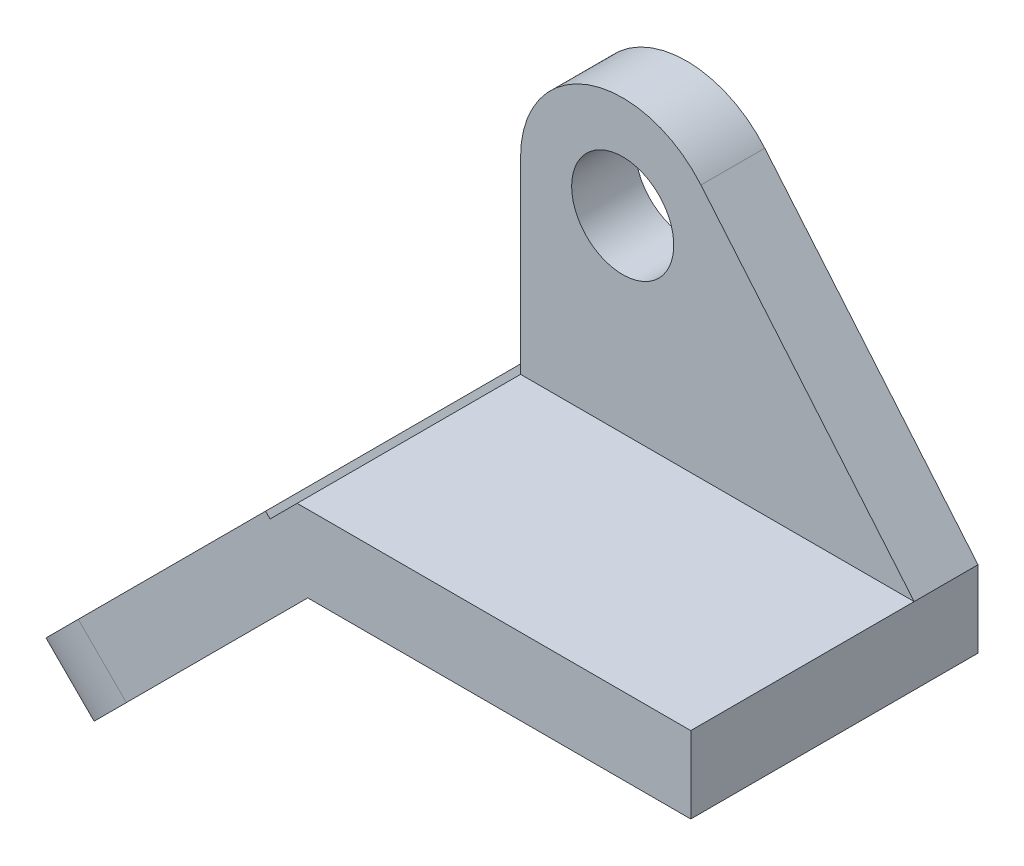
ISO-10303-21;
HEADER;
FILE_DESCRIPTION(('STEP AP214'),'2;1');
FILE_NAME('part.step','',(''),(''),'','','');
FILE_SCHEMA(('AUTOMOTIVE_DESIGN { 1 0 10303 214 1 1 1 1 }'));
ENDSEC;
DATA;
#1=APPLICATION_CONTEXT('core data for automotive mechanical design processes');
#2=APPLICATION_PROTOCOL_DEFINITION('international standard','automotive_design',2000,#1);
#3=PRODUCT_CONTEXT('',#1,'mechanical');
#4=PRODUCT('Part','Part','',(#3));
#5=PRODUCT_RELATED_PRODUCT_CATEGORY('part','',(#4));
#6=PRODUCT_DEFINITION_FORMATION('','',#4);
#7=PRODUCT_DEFINITION_CONTEXT('part definition',#1,'design');
#8=PRODUCT_DEFINITION('design','',#6,#7);
#9=PRODUCT_DEFINITION_SHAPE('','',#8);
#10=(LENGTH_UNIT() NAMED_UNIT(*) SI_UNIT(.MILLI.,.METRE.));
#11=(NAMED_UNIT(*) PLANE_ANGLE_UNIT() SI_UNIT($,.RADIAN.));
#12=(NAMED_UNIT(*) SI_UNIT($,.STERADIAN.) SOLID_ANGLE_UNIT());
#13=UNCERTAINTY_MEASURE_WITH_UNIT(LENGTH_MEASURE(1.E-05),#10,'distance_accuracy_value','');
#14=(GEOMETRIC_REPRESENTATION_CONTEXT(3) GLOBAL_UNCERTAINTY_ASSIGNED_CONTEXT((#13)) GLOBAL_UNIT_ASSIGNED_CONTEXT((#10,
#11,#12)) REPRESENTATION_CONTEXT('',''));
#15=CARTESIAN_POINT('',(0.,0.,0.));
#16=DIRECTION('',(0.,0.,1.));
#17=DIRECTION('',(1.,0.,0.));
#18=AXIS2_PLACEMENT_3D('',#15,#16,#17);
#19=CARTESIAN_POINT('',(-35.9507429885581,-20.8754143047335,22.5));
#20=DIRECTION('',(0.707106781186549,-0.707106781186546,0.));
#21=DIRECTION('',(0.707106781186546,0.707106781186549,0.));
#22=AXIS2_PLACEMENT_3D('',#19,#20,#21);
#23=CYLINDRICAL_SURFACE('',#22,22.5);
#24=DIRECTION('',(0.707106781186549,-0.707106781186546,0.));
#25=VECTOR('',#24,1.);
#26=CARTESIAN_POINT('',(-28.4130786466457,-28.4130786466459,45.));
#27=LINE('',#26,#25);
#28=CARTESIAN_POINT('',(-35.9507429885581,-20.8754143047335,45.));
#29=VERTEX_POINT('',#28);
#30=CARTESIAN_POINT('',(-28.4130786466458,-28.4130786466458,45.));
#31=VERTEX_POINT('',#30);
#32=EDGE_CURVE('E174',#29,#31,#27,.T.);
#33=ORIENTED_EDGE('',*,*,#32,.F.);
#34=CARTESIAN_POINT('',(-35.9507429885581,-20.8754143047335,22.5));
#35=DIRECTION('',(0.707106781186549,-0.707106781186546,0.));
#36=DIRECTION('',(0.707106781186546,0.707106781186549,0.));
#37=AXIS2_PLACEMENT_3D('',#34,#35,#36);
#38=CIRCLE('',#37,22.5);
#39=CARTESIAN_POINT('',(-35.9507429885581,-20.8754143047335,0.));
#40=VERTEX_POINT('',#39);
#41=EDGE_CURVE('E169',#40,#29,#38,.F.);
#42=ORIENTED_EDGE('',*,*,#41,.F.);
#43=DIRECTION('',(-0.707106781186549,0.707106781186546,0.));
#44=VECTOR('',#43,1.);
#45=CARTESIAN_POINT('',(-35.9507429885581,-20.8754143047335,0.));
#46=LINE('',#45,#44);
#47=CARTESIAN_POINT('',(-28.4130786466458,-28.4130786466458,0.));
#48=VERTEX_POINT('',#47);
#49=EDGE_CURVE('E171',#48,#40,#46,.T.);
#50=ORIENTED_EDGE('',*,*,#49,.F.);
#51=CARTESIAN_POINT('',(-28.4130786466457,-28.4130786466458,22.5));
#52=DIRECTION('',(-0.707106781186548,0.707106781186546,0.));
#53=DIRECTION('',(-0.707106781186547,-0.707106781186549,0.));
#54=AXIS2_PLACEMENT_3D('',#51,#52,#53);
#55=CIRCLE('',#54,22.5);
#56=EDGE_CURVE('E152',#31,#48,#55,.F.);
#57=ORIENTED_EDGE('',*,*,#56,.F.);
#58=EDGE_LOOP('',(#33,#42,#50,#57));
#59=FACE_BOUND('',#58,.T.);
#60=ADVANCED_FACE('F43',(#59),#23,.T.);
#61=CARTESIAN_POINT('',(0.,0.,45.));
#62=DIRECTION('',(-0.707106781186548,0.707106781186546,0.));
#63=DIRECTION('',(-0.707106781186547,-0.707106781186549,0.));
#64=AXIS2_PLACEMENT_3D('',#61,#62,#63);
#65=PLANE('',#64);
#66=DIRECTION('',(-0.707106781186547,-0.707106781186549,0.));
#67=VECTOR('',#66,1.);
#68=CARTESIAN_POINT('',(0.,0.,30.5));
#69=LINE('',#68,#67);
#70=CARTESIAN_POINT('',(-14.2709430229148,-14.2709430229149,30.5));
#71=VERTEX_POINT('',#70);
#72=CARTESIAN_POINT('',(-28.4130786466458,-28.4130786466458,30.5));
#73=VERTEX_POINT('',#72);
#74=EDGE_CURVE('E263',#71,#73,#69,.T.);
#75=ORIENTED_EDGE('',*,*,#74,.F.);
#76=CARTESIAN_POINT('',(-14.2709430229148,-14.2709430229149,22.5));
#77=DIRECTION('',(-0.707106781186548,0.707106781186546,0.));
#78=DIRECTION('',(-0.707106781186547,-0.707106781186549,0.));
#79=AXIS2_PLACEMENT_3D('',#76,#77,#78);
#80=CIRCLE('',#79,8.);
#81=CARTESIAN_POINT('',(-14.2709430229148,-14.2709430229149,14.5));
#82=VERTEX_POINT('',#81);
#83=EDGE_CURVE('E258',#71,#82,#80,.T.);
#84=ORIENTED_EDGE('',*,*,#83,.T.);
#85=DIRECTION('',(-0.707106781186547,-0.707106781186549,0.));
#86=VECTOR('',#85,1.);
#87=CARTESIAN_POINT('',(0.,0.,14.5));
#88=LINE('',#87,#86);
#89=CARTESIAN_POINT('',(-28.4130786466458,-28.4130786466458,14.5));
#90=VERTEX_POINT('',#89);
#91=EDGE_CURVE('E266',#82,#90,#88,.T.);
#92=ORIENTED_EDGE('',*,*,#91,.T.);
#93=CARTESIAN_POINT('',(-28.4130786466458,-28.4130786466458,22.5));
#94=DIRECTION('',(-0.707106781186548,0.707106781186546,0.));
#95=DIRECTION('',(-0.707106781186547,-0.707106781186549,0.));
#96=AXIS2_PLACEMENT_3D('',#93,#94,#95);
#97=CIRCLE('',#96,8.00000000000001);
#98=EDGE_CURVE('E159',#90,#73,#97,.T.);
#99=ORIENTED_EDGE('',*,*,#98,.T.);
#100=EDGE_LOOP('',(#75,#84,#92,#99));
#101=FACE_BOUND('',#100,.T.);
#102=DIRECTION('',(0.707106781186547,0.707106781186549,0.));
#103=VECTOR('',#102,1.);
#104=CARTESIAN_POINT('',(0.,0.,45.));
#105=LINE('',#104,#103);
#106=CARTESIAN_POINT('',(0.,0.,45.));
#107=VERTEX_POINT('',#106);
#108=EDGE_CURVE('E199',#31,#107,#105,.T.);
#109=ORIENTED_EDGE('',*,*,#108,.F.);
#110=ORIENTED_EDGE('',*,*,#56,.T.);
#111=DIRECTION('',(0.707106781186547,0.707106781186549,0.));
#112=VECTOR('',#111,1.);
#113=CARTESIAN_POINT('',(0.,0.,0.));
#114=LINE('',#113,#112);
#115=CARTESIAN_POINT('',(0.,0.,0.));
#116=VERTEX_POINT('',#115);
#117=EDGE_CURVE('E209',#48,#116,#114,.T.);
#118=ORIENTED_EDGE('',*,*,#117,.T.);
#119=DIRECTION('',(0.,0.,-1.));
#120=VECTOR('',#119,1.);
#121=CARTESIAN_POINT('',(0.,0.,45.));
#122=LINE('',#121,#120);
#123=EDGE_CURVE('E177',#107,#116,#122,.T.);
#124=ORIENTED_EDGE('',*,*,#123,.F.);
#125=EDGE_LOOP('',(#109,#110,#118,#124));
#126=FACE_BOUND('',#125,.T.);
#127=ADVANCED_FACE('F279',(#101,#126),#65,.F.);
#128=CARTESIAN_POINT('',(0.,0.,45.));
#129=DIRECTION('',(0.,1.,0.));
#130=DIRECTION('',(0.,0.,1.));
#131=AXIS2_PLACEMENT_3D('',#128,#129,#130);
#132=PLANE('',#131);
#133=DIRECTION('',(1.,0.,0.));
#134=VECTOR('',#133,1.);
#135=CARTESIAN_POINT('',(0.,0.,0.));
#136=LINE('',#135,#134);
#137=CARTESIAN_POINT('',(60.,0.,0.));
#138=VERTEX_POINT('',#137);
#139=EDGE_CURVE('E207',#116,#138,#136,.T.);
#140=ORIENTED_EDGE('',*,*,#139,.T.);
#141=DIRECTION('',(0.,0.,-1.));
#142=VECTOR('',#141,1.);
#143=CARTESIAN_POINT('',(60.,0.,45.));
#144=LINE('',#143,#142);
#145=CARTESIAN_POINT('',(60.,0.,45.));
#146=VERTEX_POINT('',#145);
#147=EDGE_CURVE('E180',#146,#138,#144,.T.);
#148=ORIENTED_EDGE('',*,*,#147,.F.);
#149=DIRECTION('',(1.,0.,0.));
#150=VECTOR('',#149,1.);
#151=CARTESIAN_POINT('',(0.,0.,45.));
#152=LINE('',#151,#150);
#153=EDGE_CURVE('E222',#107,#146,#152,.T.);
#154=ORIENTED_EDGE('',*,*,#153,.F.);
#155=ORIENTED_EDGE('',*,*,#123,.T.);
#156=EDGE_LOOP('',(#140,#148,#154,#155));
#157=FACE_BOUND('',#156,.T.);
#158=ADVANCED_FACE('F282',(#157),#132,.F.);
#159=CARTESIAN_POINT('',(60.,0.,45.));
#160=DIRECTION('',(-1.,0.,0.));
#161=DIRECTION('',(0.,-1.,0.));
#162=AXIS2_PLACEMENT_3D('',#159,#160,#161);
#163=PLANE('',#162);
#164=DIRECTION('',(0.,1.,0.));
#165=VECTOR('',#164,1.);
#166=CARTESIAN_POINT('',(60.,0.,0.));
#167=LINE('',#166,#165);
#168=CARTESIAN_POINT('',(60.,12.,0.));
#169=VERTEX_POINT('',#168);
#170=EDGE_CURVE('E204',#138,#169,#167,.T.);
#171=ORIENTED_EDGE('',*,*,#170,.T.);
#172=DIRECTION('',(0.,0.,-1.));
#173=VECTOR('',#172,1.);
#174=CARTESIAN_POINT('',(60.,12.,10.));
#175=LINE('',#174,#173);
#176=CARTESIAN_POINT('',(60.,12.,10.));
#177=VERTEX_POINT('',#176);
#178=EDGE_CURVE('E211',#177,#169,#175,.T.);
#179=ORIENTED_EDGE('',*,*,#178,.F.);
#180=DIRECTION('',(0.,0.,-1.));
#181=VECTOR('',#180,1.);
#182=CARTESIAN_POINT('',(60.,12.,45.));
#183=LINE('',#182,#181);
#184=CARTESIAN_POINT('',(60.,12.,45.));
#185=VERTEX_POINT('',#184);
#186=EDGE_CURVE('E183',#185,#177,#183,.T.);
#187=ORIENTED_EDGE('',*,*,#186,.F.);
#188=DIRECTION('',(0.,1.,0.));
#189=VECTOR('',#188,1.);
#190=CARTESIAN_POINT('',(60.,0.,45.));
#191=LINE('',#190,#189);
#192=EDGE_CURVE('E220',#146,#185,#191,.T.);
#193=ORIENTED_EDGE('',*,*,#192,.F.);
#194=ORIENTED_EDGE('',*,*,#147,.T.);
#195=EDGE_LOOP('',(#171,#179,#187,#193,#194));
#196=FACE_BOUND('',#195,.T.);
#197=ADVANCED_FACE('F297',(#196),#163,.F.);
#198=CARTESIAN_POINT('',(60.,12.,45.));
#199=DIRECTION('',(0.,-1.,0.));
#200=DIRECTION('',(1.,0.,0.));
#201=AXIS2_PLACEMENT_3D('',#198,#199,#200);
#202=PLANE('',#201);
#203=ORIENTED_EDGE('',*,*,#186,.T.);
#204=DIRECTION('',(-1.,0.,0.));
#205=VECTOR('',#204,1.);
#206=CARTESIAN_POINT('',(60.,12.,10.));
#207=LINE('',#206,#205);
#208=CARTESIAN_POINT('',(-1.66111512145166,12.,10.));
#209=VERTEX_POINT('',#208);
#210=EDGE_CURVE('E237',#177,#209,#207,.T.);
#211=ORIENTED_EDGE('',*,*,#210,.T.);
#212=DIRECTION('',(0.,0.,-1.));
#213=VECTOR('',#212,1.);
#214=CARTESIAN_POINT('',(-1.66111512145166,12.,45.));
#215=LINE('',#214,#213);
#216=CARTESIAN_POINT('',(-1.66111512145166,12.,45.));
#217=VERTEX_POINT('',#216);
#218=EDGE_CURVE('E186',#217,#209,#215,.T.);
#219=ORIENTED_EDGE('',*,*,#218,.F.);
#220=DIRECTION('',(-1.,0.,0.));
#221=VECTOR('',#220,1.);
#222=CARTESIAN_POINT('',(60.,12.,45.));
#223=LINE('',#222,#221);
#224=EDGE_CURVE('E218',#185,#217,#223,.T.);
#225=ORIENTED_EDGE('',*,*,#224,.F.);
#226=EDGE_LOOP('',(#203,#211,#219,#225));
#227=FACE_BOUND('',#226,.T.);
#228=ADVANCED_FACE('F304',(#227),#202,.F.);
#229=CARTESIAN_POINT('',(-1.66111512145166,12.,45.));
#230=DIRECTION('',(0.707106781186548,-0.707106781186546,0.));
#231=DIRECTION('',(0.707106781186546,0.707106781186549,0.));
#232=AXIS2_PLACEMENT_3D('',#229,#230,#231);
#233=PLANE('',#232);
#234=DIRECTION('',(-0.707106781186546,-0.707106781186548,0.));
#235=VECTOR('',#234,1.);
#236=CARTESIAN_POINT('',(-1.66111512145166,12.,0.));
#237=LINE('',#236,#235);
#238=CARTESIAN_POINT('',(-1.66111512145166,12.,0.));
#239=VERTEX_POINT('',#238);
#240=CARTESIAN_POINT('',(-5.90375580857094,7.7573593128807,0.));
#241=VERTEX_POINT('',#240);
#242=EDGE_CURVE('E202',#239,#241,#237,.T.);
#243=ORIENTED_EDGE('',*,*,#242,.T.);
#244=DIRECTION('',(0.,0.,-1.));
#245=VECTOR('',#244,1.);
#246=CARTESIAN_POINT('',(-5.90375580857094,7.7573593128807,45.));
#247=LINE('',#246,#245);
#248=CARTESIAN_POINT('',(-5.90375580857094,7.7573593128807,45.));
#249=VERTEX_POINT('',#248);
#250=EDGE_CURVE('E189',#249,#241,#247,.T.);
#251=ORIENTED_EDGE('',*,*,#250,.F.);
#252=DIRECTION('',(-0.707106781186546,-0.707106781186548,0.));
#253=VECTOR('',#252,1.);
#254=CARTESIAN_POINT('',(-1.66111512145166,12.,45.));
#255=LINE('',#254,#253);
#256=EDGE_CURVE('E216',#217,#249,#255,.T.);
#257=ORIENTED_EDGE('',*,*,#256,.F.);
#258=ORIENTED_EDGE('',*,*,#218,.T.);
#259=DIRECTION('',(0.,0.,-1.));
#260=VECTOR('',#259,1.);
#261=CARTESIAN_POINT('',(-1.66111512145166,12.,10.));
#262=LINE('',#261,#260);
#263=EDGE_CURVE('E225',#209,#239,#262,.T.);
#264=ORIENTED_EDGE('',*,*,#263,.T.);
#265=EDGE_LOOP('',(#243,#251,#257,#258,#264));
#266=FACE_BOUND('',#265,.T.);
#267=ADVANCED_FACE('F306',(#266),#233,.F.);
#268=CARTESIAN_POINT('',(-5.90375580857094,7.7573593128807,45.));
#269=DIRECTION('',(-0.707106781186546,-0.707106781186549,0.));
#270=DIRECTION('',(0.707106781186549,-0.707106781186546,0.));
#271=AXIS2_PLACEMENT_3D('',#268,#269,#270);
#272=PLANE('',#271);
#273=DIRECTION('',(-0.707106781186549,0.707106781186546,0.));
#274=VECTOR('',#273,1.);
#275=CARTESIAN_POINT('',(-5.90375580857094,7.7573593128807,0.));
#276=LINE('',#275,#274);
#277=CARTESIAN_POINT('',(-6.61086258975749,8.46446609406725,0.));
#278=VERTEX_POINT('',#277);
#279=EDGE_CURVE('E200',#241,#278,#276,.T.);
#280=ORIENTED_EDGE('',*,*,#279,.T.);
#281=DIRECTION('',(0.,0.,-1.));
#282=VECTOR('',#281,1.);
#283=CARTESIAN_POINT('',(-6.61086258975749,8.46446609406725,45.));
#284=LINE('',#283,#282);
#285=CARTESIAN_POINT('',(-6.61086258975749,8.46446609406725,45.));
#286=VERTEX_POINT('',#285);
#287=EDGE_CURVE('E192',#286,#278,#284,.T.);
#288=ORIENTED_EDGE('',*,*,#287,.F.);
#289=DIRECTION('',(-0.707106781186549,0.707106781186546,0.));
#290=VECTOR('',#289,1.);
#291=CARTESIAN_POINT('',(-5.90375580857094,7.7573593128807,45.));
#292=LINE('',#291,#290);
#293=EDGE_CURVE('E214',#249,#286,#292,.T.);
#294=ORIENTED_EDGE('',*,*,#293,.F.);
#295=ORIENTED_EDGE('',*,*,#250,.T.);
#296=EDGE_LOOP('',(#280,#288,#294,#295));
#297=FACE_BOUND('',#296,.T.);
#298=ADVANCED_FACE('F312',(#297),#272,.F.);
#299=CARTESIAN_POINT('',(-6.61086258975749,8.46446609406725,45.));
#300=DIRECTION('',(0.707106781186549,-0.707106781186546,0.));
#301=DIRECTION('',(0.707106781186546,0.707106781186549,0.));
#302=AXIS2_PLACEMENT_3D('',#299,#300,#301);
#303=PLANE('',#302);
#304=DIRECTION('',(0.707106781186546,0.707106781186549,0.));
#305=VECTOR('',#304,1.);
#306=CARTESIAN_POINT('',(-6.61086258975748,8.46446609406725,14.5));
#307=LINE('',#306,#305);
#308=CARTESIAN_POINT('',(-35.9507429885581,-20.8754143047335,14.5));
#309=VERTEX_POINT('',#308);
#310=CARTESIAN_POINT('',(-21.8086073648272,-6.73327868100252,14.5));
#311=VERTEX_POINT('',#310);
#312=EDGE_CURVE('E147',#309,#311,#307,.T.);
#313=ORIENTED_EDGE('',*,*,#312,.T.);
#314=CARTESIAN_POINT('',(-21.8086073648272,-6.73327868100251,22.5));
#315=DIRECTION('',(0.707106781186549,-0.707106781186546,0.));
#316=DIRECTION('',(0.707106781186546,0.707106781186549,0.));
#317=AXIS2_PLACEMENT_3D('',#314,#315,#316);
#318=CIRCLE('',#317,8.);
#319=CARTESIAN_POINT('',(-21.8086073648272,-6.73327868100252,30.5));
#320=VERTEX_POINT('',#319);
#321=EDGE_CURVE('E11',#311,#320,#318,.T.);
#322=ORIENTED_EDGE('',*,*,#321,.T.);
#323=DIRECTION('',(0.707106781186546,0.707106781186549,0.));
#324=VECTOR('',#323,1.);
#325=CARTESIAN_POINT('',(-6.61086258975749,8.46446609406724,30.5));
#326=LINE('',#325,#324);
#327=CARTESIAN_POINT('',(-35.9507429885581,-20.8754143047335,30.5));
#328=VERTEX_POINT('',#327);
#329=EDGE_CURVE('E51',#328,#320,#326,.T.);
#330=ORIENTED_EDGE('',*,*,#329,.F.);
#331=CARTESIAN_POINT('',(-35.9507429885581,-20.8754143047335,22.5));
#332=DIRECTION('',(0.707106781186549,-0.707106781186546,0.));
#333=DIRECTION('',(0.707106781186546,0.707106781186549,0.));
#334=AXIS2_PLACEMENT_3D('',#331,#332,#333);
#335=CIRCLE('',#334,8.00000000000001);
#336=EDGE_CURVE('E151',#328,#309,#335,.T.);
#337=ORIENTED_EDGE('',*,*,#336,.T.);
#338=EDGE_LOOP('',(#313,#322,#330,#337));
#339=FACE_BOUND('',#338,.T.);
#340=DIRECTION('',(-0.707106781186546,-0.707106781186549,0.));
#341=VECTOR('',#340,1.);
#342=CARTESIAN_POINT('',(-6.61086258975749,8.46446609406725,0.));
#343=LINE('',#342,#341);
#344=EDGE_CURVE('E196',#278,#40,#343,.T.);
#345=ORIENTED_EDGE('',*,*,#344,.T.);
#346=ORIENTED_EDGE('',*,*,#41,.T.);
#347=DIRECTION('',(-0.707106781186546,-0.707106781186549,0.));
#348=VECTOR('',#347,1.);
#349=CARTESIAN_POINT('',(-6.61086258975749,8.46446609406725,45.));
#350=LINE('',#349,#348);
#351=EDGE_CURVE('E195',#286,#29,#350,.T.);
#352=ORIENTED_EDGE('',*,*,#351,.F.);
#353=ORIENTED_EDGE('',*,*,#287,.T.);
#354=EDGE_LOOP('',(#345,#346,#352,#353));
#355=FACE_BOUND('',#354,.T.);
#356=ADVANCED_FACE('F164',(#339,#355),#303,.F.);
#357=CARTESIAN_POINT('',(0.,0.,45.));
#358=DIRECTION('',(0.,0.,-1.));
#359=DIRECTION('',(-1.,0.,0.));
#360=AXIS2_PLACEMENT_3D('',#357,#358,#359);
#361=PLANE('',#360);
#362=ORIENTED_EDGE('',*,*,#351,.T.);
#363=ORIENTED_EDGE('',*,*,#32,.T.);
#364=ORIENTED_EDGE('',*,*,#108,.T.);
#365=ORIENTED_EDGE('',*,*,#153,.T.);
#366=ORIENTED_EDGE('',*,*,#192,.T.);
#367=ORIENTED_EDGE('',*,*,#224,.T.);
#368=ORIENTED_EDGE('',*,*,#256,.T.);
#369=ORIENTED_EDGE('',*,*,#293,.T.);
#370=EDGE_LOOP('',(#362,#363,#364,#365,#366,#367,#368,#369));
#371=FACE_BOUND('',#370,.T.);
#372=ADVANCED_FACE('F288',(#371),#361,.F.);
#373=CARTESIAN_POINT('',(0.,0.,0.));
#374=DIRECTION('',(0.,0.,-1.));
#375=DIRECTION('',(-1.,0.,0.));
#376=AXIS2_PLACEMENT_3D('',#373,#374,#375);
#377=PLANE('',#376);
#378=ORIENTED_EDGE('',*,*,#117,.F.);
#379=ORIENTED_EDGE('',*,*,#49,.T.);
#380=ORIENTED_EDGE('',*,*,#344,.F.);
#381=ORIENTED_EDGE('',*,*,#279,.F.);
#382=ORIENTED_EDGE('',*,*,#242,.F.);
#383=DIRECTION('',(0.,1.,0.));
#384=VECTOR('',#383,1.);
#385=CARTESIAN_POINT('',(-1.66111512145166,12.,0.));
#386=LINE('',#385,#384);
#387=CARTESIAN_POINT('',(-1.66111512145166,41.5252167580814,0.));
#388=VERTEX_POINT('',#387);
#389=EDGE_CURVE('E241',#239,#388,#386,.T.);
#390=ORIENTED_EDGE('',*,*,#389,.T.);
#391=CARTESIAN_POINT('',(14.3388848785483,41.5252167580814,0.));
#392=DIRECTION('',(0.,0.,-1.));
#393=DIRECTION('',(-1.,0.,0.));
#394=AXIS2_PLACEMENT_3D('',#391,#392,#393);
#395=CIRCLE('',#394,16.);
#396=CARTESIAN_POINT('',(26.595595968452,51.809818513066,0.));
#397=VERTEX_POINT('',#396);
#398=EDGE_CURVE('E238',#388,#397,#395,.T.);
#399=ORIENTED_EDGE('',*,*,#398,.T.);
#400=DIRECTION('',(0.642787609686538,-0.766044443118979,0.));
#401=VECTOR('',#400,1.);
#402=CARTESIAN_POINT('',(60.,12.,0.));
#403=LINE('',#402,#401);
#404=EDGE_CURVE('E234',#397,#169,#403,.T.);
#405=ORIENTED_EDGE('',*,*,#404,.T.);
#406=ORIENTED_EDGE('',*,*,#170,.F.);
#407=ORIENTED_EDGE('',*,*,#139,.F.);
#408=EDGE_LOOP('',(#378,#379,#380,#381,#382,#390,#399,#405,#406,#407));
#409=FACE_BOUND('',#408,.T.);
#410=CARTESIAN_POINT('',(14.3388848785483,41.5252167580814,0.));
#411=DIRECTION('',(0.,0.,-1.));
#412=DIRECTION('',(-1.,0.,0.));
#413=AXIS2_PLACEMENT_3D('',#410,#411,#412);
#414=CIRCLE('',#413,8.);
#415=CARTESIAN_POINT('',(6.33888487854834,41.5252167580814,0.));
#416=VERTEX_POINT('',#415);
#417=EDGE_CURVE('E255',#416,#416,#414,.T.);
#418=ORIENTED_EDGE('',*,*,#417,.F.);
#419=EDGE_LOOP('',(#418));
#420=FACE_BOUND('',#419,.T.);
#421=ADVANCED_FACE('F318',(#409,#420),#377,.T.);
#422=CARTESIAN_POINT('',(60.,12.,10.));
#423=DIRECTION('',(0.766044443118979,0.642787609686538,0.));
#424=DIRECTION('',(-0.642787609686538,0.766044443118979,0.));
#425=AXIS2_PLACEMENT_3D('',#422,#423,#424);
#426=PLANE('',#425);
#427=ORIENTED_EDGE('',*,*,#404,.F.);
#428=DIRECTION('',(0.,0.,-1.));
#429=VECTOR('',#428,1.);
#430=CARTESIAN_POINT('',(26.595595968452,51.809818513066,10.));
#431=LINE('',#430,#429);
#432=CARTESIAN_POINT('',(26.595595968452,51.809818513066,10.));
#433=VERTEX_POINT('',#432);
#434=EDGE_CURVE('E231',#433,#397,#431,.T.);
#435=ORIENTED_EDGE('',*,*,#434,.F.);
#436=DIRECTION('',(0.642787609686538,-0.766044443118979,0.));
#437=VECTOR('',#436,1.);
#438=CARTESIAN_POINT('',(60.,12.,10.));
#439=LINE('',#438,#437);
#440=EDGE_CURVE('E229',#433,#177,#439,.T.);
#441=ORIENTED_EDGE('',*,*,#440,.T.);
#442=ORIENTED_EDGE('',*,*,#178,.T.);
#443=EDGE_LOOP('',(#427,#435,#441,#442));
#444=FACE_BOUND('',#443,.T.);
#445=ADVANCED_FACE('F322',(#444),#426,.T.);
#446=CARTESIAN_POINT('',(14.3388848785483,41.5252167580814,10.));
#447=DIRECTION('',(0.,0.,-1.));
#448=DIRECTION('',(-1.,0.,0.));
#449=AXIS2_PLACEMENT_3D('',#446,#447,#448);
#450=CYLINDRICAL_SURFACE('',#449,16.);
#451=ORIENTED_EDGE('',*,*,#398,.F.);
#452=DIRECTION('',(0.,0.,-1.));
#453=VECTOR('',#452,1.);
#454=CARTESIAN_POINT('',(-1.66111512145166,41.5252167580814,10.));
#455=LINE('',#454,#453);
#456=CARTESIAN_POINT('',(-1.66111512145166,41.5252167580814,10.));
#457=VERTEX_POINT('',#456);
#458=EDGE_CURVE('E228',#457,#388,#455,.T.);
#459=ORIENTED_EDGE('',*,*,#458,.F.);
#460=CARTESIAN_POINT('',(14.3388848785483,41.5252167580814,10.));
#461=DIRECTION('',(0.,0.,-1.));
#462=DIRECTION('',(-1.,0.,0.));
#463=AXIS2_PLACEMENT_3D('',#460,#461,#462);
#464=CIRCLE('',#463,16.);
#465=EDGE_CURVE('E247',#457,#433,#464,.T.);
#466=ORIENTED_EDGE('',*,*,#465,.T.);
#467=ORIENTED_EDGE('',*,*,#434,.T.);
#468=EDGE_LOOP('',(#451,#459,#466,#467));
#469=FACE_BOUND('',#468,.T.);
#470=ADVANCED_FACE('F332',(#469),#450,.T.);
#471=CARTESIAN_POINT('',(-1.66111512145166,12.,10.));
#472=DIRECTION('',(-1.,0.,0.));
#473=DIRECTION('',(0.,-1.,0.));
#474=AXIS2_PLACEMENT_3D('',#471,#472,#473);
#475=PLANE('',#474);
#476=ORIENTED_EDGE('',*,*,#389,.F.);
#477=ORIENTED_EDGE('',*,*,#263,.F.);
#478=DIRECTION('',(0.,1.,0.));
#479=VECTOR('',#478,1.);
#480=CARTESIAN_POINT('',(-1.66111512145166,12.,10.));
#481=LINE('',#480,#479);
#482=EDGE_CURVE('E250',#209,#457,#481,.T.);
#483=ORIENTED_EDGE('',*,*,#482,.T.);
#484=ORIENTED_EDGE('',*,*,#458,.T.);
#485=EDGE_LOOP('',(#476,#477,#483,#484));
#486=FACE_BOUND('',#485,.T.);
#487=ADVANCED_FACE('F329',(#486),#475,.T.);
#488=CARTESIAN_POINT('',(14.3388848785483,41.5252167580814,10.));
#489=DIRECTION('',(0.,0.,-1.));
#490=DIRECTION('',(-1.,0.,0.));
#491=AXIS2_PLACEMENT_3D('',#488,#489,#490);
#492=PLANE('',#491);
#493=CARTESIAN_POINT('',(14.3388848785483,41.5252167580814,10.));
#494=DIRECTION('',(0.,0.,-1.));
#495=DIRECTION('',(-1.,0.,0.));
#496=AXIS2_PLACEMENT_3D('',#493,#494,#495);
#497=CIRCLE('',#496,8.);
#498=CARTESIAN_POINT('',(6.33888487854834,41.5252167580814,10.));
#499=VERTEX_POINT('',#498);
#500=EDGE_CURVE('E244',#499,#499,#497,.T.);
#501=ORIENTED_EDGE('',*,*,#500,.T.);
#502=EDGE_LOOP('',(#501));
#503=FACE_BOUND('',#502,.T.);
#504=ORIENTED_EDGE('',*,*,#210,.F.);
#505=ORIENTED_EDGE('',*,*,#440,.F.);
#506=ORIENTED_EDGE('',*,*,#465,.F.);
#507=ORIENTED_EDGE('',*,*,#482,.F.);
#508=EDGE_LOOP('',(#504,#505,#506,#507));
#509=FACE_BOUND('',#508,.T.);
#510=ADVANCED_FACE('F326',(#503,#509),#492,.F.);
#511=CARTESIAN_POINT('',(14.3388848785483,41.5252167580814,10.));
#512=DIRECTION('',(0.,0.,-1.));
#513=DIRECTION('',(-1.,0.,0.));
#514=AXIS2_PLACEMENT_3D('',#511,#512,#513);
#515=CYLINDRICAL_SURFACE('',#514,8.);
#516=ORIENTED_EDGE('',*,*,#500,.F.);
#517=EDGE_LOOP('',(#516));
#518=FACE_BOUND('',#517,.T.);
#519=ORIENTED_EDGE('',*,*,#417,.T.);
#520=EDGE_LOOP('',(#519));
#521=FACE_BOUND('',#520,.T.);
#522=ADVANCED_FACE('F350',(#518,#521),#515,.F.);
#523=CARTESIAN_POINT('',(37.8905475887569,-66.4324336345864,22.5));
#524=DIRECTION('',(-0.707106781186549,0.707106781186546,0.));
#525=DIRECTION('',(-0.707106781186546,-0.707106781186549,0.));
#526=AXIS2_PLACEMENT_3D('',#523,#524,#525);
#527=CYLINDRICAL_SURFACE('',#526,8.);
#528=DIRECTION('',(-0.707106781186549,0.707106781186546,0.));
#529=VECTOR('',#528,1.);
#530=CARTESIAN_POINT('',(37.8905475887569,-66.4324336345864,30.5));
#531=LINE('',#530,#529);
#532=EDGE_CURVE('E268',#71,#320,#531,.T.);
#533=ORIENTED_EDGE('',*,*,#532,.T.);
#534=ORIENTED_EDGE('',*,*,#321,.F.);
#535=DIRECTION('',(-0.707106781186549,0.707106781186546,0.));
#536=VECTOR('',#535,1.);
#537=CARTESIAN_POINT('',(37.8905475887569,-66.4324336345864,14.5));
#538=LINE('',#537,#536);
#539=EDGE_CURVE('E63',#82,#311,#538,.T.);
#540=ORIENTED_EDGE('',*,*,#539,.F.);
#541=ORIENTED_EDGE('',*,*,#83,.F.);
#542=EDGE_LOOP('',(#533,#534,#540,#541));
#543=FACE_BOUND('',#542,.T.);
#544=ADVANCED_FACE('F274',(#543),#527,.F.);
#545=CARTESIAN_POINT('',(37.8905475887569,-66.4324336345864,30.5));
#546=DIRECTION('',(0.,0.,-1.));
#547=DIRECTION('',(0.,1.,0.));
#548=AXIS2_PLACEMENT_3D('',#545,#546,#547);
#549=PLANE('',#548);
#550=ORIENTED_EDGE('',*,*,#74,.T.);
#551=DIRECTION('',(-0.707106781186549,0.707106781186546,0.));
#552=VECTOR('',#551,1.);
#553=CARTESIAN_POINT('',(23.7484119650259,-80.5745692583174,30.5));
#554=LINE('',#553,#552);
#555=EDGE_CURVE('E161',#73,#328,#554,.T.);
#556=ORIENTED_EDGE('',*,*,#555,.T.);
#557=ORIENTED_EDGE('',*,*,#329,.T.);
#558=ORIENTED_EDGE('',*,*,#532,.F.);
#559=EDGE_LOOP('',(#550,#556,#557,#558));
#560=FACE_BOUND('',#559,.T.);
#561=ADVANCED_FACE('F277',(#560),#549,.T.);
#562=CARTESIAN_POINT('',(23.7484119650259,-80.5745692583174,22.5));
#563=DIRECTION('',(-0.707106781186549,0.707106781186546,0.));
#564=DIRECTION('',(-0.707106781186546,-0.707106781186549,0.));
#565=AXIS2_PLACEMENT_3D('',#562,#563,#564);
#566=CYLINDRICAL_SURFACE('',#565,8.00000000000001);
#567=DIRECTION('',(-0.707106781186549,0.707106781186546,0.));
#568=VECTOR('',#567,1.);
#569=CARTESIAN_POINT('',(23.7484119650259,-80.5745692583174,14.5));
#570=LINE('',#569,#568);
#571=EDGE_CURVE('E58',#90,#309,#570,.T.);
#572=ORIENTED_EDGE('',*,*,#571,.T.);
#573=ORIENTED_EDGE('',*,*,#336,.F.);
#574=ORIENTED_EDGE('',*,*,#555,.F.);
#575=ORIENTED_EDGE('',*,*,#98,.F.);
#576=EDGE_LOOP('',(#572,#573,#574,#575));
#577=FACE_BOUND('',#576,.T.);
#578=ADVANCED_FACE('F155',(#577),#566,.F.);
#579=CARTESIAN_POINT('',(37.8905475887569,-66.4324336345864,14.5));
#580=DIRECTION('',(0.,0.,-1.));
#581=DIRECTION('',(0.,1.,0.));
#582=AXIS2_PLACEMENT_3D('',#579,#580,#581);
#583=PLANE('',#582);
#584=ORIENTED_EDGE('',*,*,#539,.T.);
#585=ORIENTED_EDGE('',*,*,#312,.F.);
#586=ORIENTED_EDGE('',*,*,#571,.F.);
#587=ORIENTED_EDGE('',*,*,#91,.F.);
#588=EDGE_LOOP('',(#584,#585,#586,#587));
#589=FACE_BOUND('',#588,.T.);
#590=ADVANCED_FACE('F148',(#589),#583,.F.);
#591=CLOSED_SHELL('',(#60,#127,#158,#197,#228,#267,#298,#356,#372,#421,#445,#470,#487,#510,#522,
#544,#561,#578,#590));
#592=MANIFOLD_SOLID_BREP('B2',#591);
#593=ADVANCED_BREP_SHAPE_REPRESENTATION('',(#18,#592),#14);
#594=SHAPE_DEFINITION_REPRESENTATION(#9,#593);
ENDSEC;
END-ISO-10303-21;
